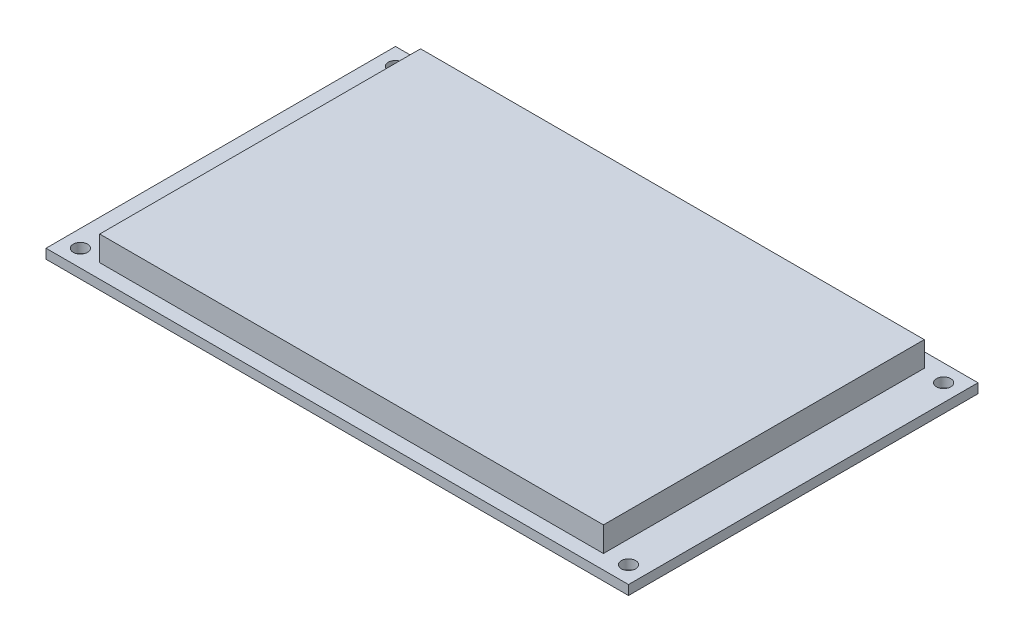
ISO-10303-21;
HEADER;
FILE_DESCRIPTION(('STEP AP214'),'2;1');
FILE_NAME('part.step','',(''),(''),'','','');
FILE_SCHEMA(('AUTOMOTIVE_DESIGN { 1 0 10303 214 1 1 1 1 }'));
ENDSEC;
DATA;
#1=APPLICATION_CONTEXT('core data for automotive mechanical design processes');
#2=APPLICATION_PROTOCOL_DEFINITION('international standard','automotive_design',2000,#1);
#3=PRODUCT_CONTEXT('',#1,'mechanical');
#4=PRODUCT('Part','Part','',(#3));
#5=PRODUCT_RELATED_PRODUCT_CATEGORY('part','',(#4));
#6=PRODUCT_DEFINITION_FORMATION('','',#4);
#7=PRODUCT_DEFINITION_CONTEXT('part definition',#1,'design');
#8=PRODUCT_DEFINITION('design','',#6,#7);
#9=PRODUCT_DEFINITION_SHAPE('','',#8);
#10=(LENGTH_UNIT() NAMED_UNIT(*) SI_UNIT(.MILLI.,.METRE.));
#11=(NAMED_UNIT(*) PLANE_ANGLE_UNIT() SI_UNIT($,.RADIAN.));
#12=(NAMED_UNIT(*) SI_UNIT($,.STERADIAN.) SOLID_ANGLE_UNIT());
#13=UNCERTAINTY_MEASURE_WITH_UNIT(LENGTH_MEASURE(1.E-05),#10,'distance_accuracy_value','');
#14=(GEOMETRIC_REPRESENTATION_CONTEXT(3) GLOBAL_UNCERTAINTY_ASSIGNED_CONTEXT((#13)) GLOBAL_UNIT_ASSIGNED_CONTEXT((#10,
#11,#12)) REPRESENTATION_CONTEXT('',''));
#15=CARTESIAN_POINT('',(0.,0.,0.));
#16=DIRECTION('',(0.,0.,1.));
#17=DIRECTION('',(1.,0.,0.));
#18=AXIS2_PLACEMENT_3D('',#15,#16,#17);
#19=CARTESIAN_POINT('',(0.,2.,0.));
#20=DIRECTION('',(0.,-1.,0.));
#21=DIRECTION('',(0.,0.,-1.));
#22=AXIS2_PLACEMENT_3D('',#19,#20,#21);
#23=PLANE('',#22);
#24=CARTESIAN_POINT('',(-57.4,2.,-33.));
#25=DIRECTION('',(0.,1.,0.));
#26=DIRECTION('',(0.,0.,-1.));
#27=AXIS2_PLACEMENT_3D('',#24,#25,#26);
#28=CIRCLE('',#27,1.5);
#29=CARTESIAN_POINT('',(-57.4,2.,-34.5));
#30=VERTEX_POINT('',#29);
#31=EDGE_CURVE('E129',#30,#30,#28,.T.);
#32=ORIENTED_EDGE('',*,*,#31,.F.);
#33=EDGE_LOOP('',(#32));
#34=FACE_BOUND('',#33,.T.);
#35=CARTESIAN_POINT('',(-57.4,2.,33.));
#36=DIRECTION('',(0.,1.,0.));
#37=DIRECTION('',(0.,0.,1.));
#38=AXIS2_PLACEMENT_3D('',#35,#36,#37);
#39=CIRCLE('',#38,1.5);
#40=CARTESIAN_POINT('',(-57.4,2.,34.5));
#41=VERTEX_POINT('',#40);
#42=EDGE_CURVE('E138',#41,#41,#39,.T.);
#43=ORIENTED_EDGE('',*,*,#42,.F.);
#44=EDGE_LOOP('',(#43));
#45=FACE_BOUND('',#44,.T.);
#46=CARTESIAN_POINT('',(57.4,2.,33.));
#47=DIRECTION('',(0.,1.,0.));
#48=DIRECTION('',(0.,0.,-1.));
#49=AXIS2_PLACEMENT_3D('',#46,#47,#48);
#50=CIRCLE('',#49,1.5);
#51=CARTESIAN_POINT('',(57.4,2.,31.5));
#52=VERTEX_POINT('',#51);
#53=EDGE_CURVE('E144',#52,#52,#50,.T.);
#54=ORIENTED_EDGE('',*,*,#53,.F.);
#55=EDGE_LOOP('',(#54));
#56=FACE_BOUND('',#55,.T.);
#57=CARTESIAN_POINT('',(57.4,2.,-33.));
#58=DIRECTION('',(0.,1.,0.));
#59=DIRECTION('',(0.,0.,1.));
#60=AXIS2_PLACEMENT_3D('',#57,#58,#59);
#61=CIRCLE('',#60,1.5);
#62=CARTESIAN_POINT('',(57.4,2.,-31.5));
#63=VERTEX_POINT('',#62);
#64=EDGE_CURVE('E150',#63,#63,#61,.T.);
#65=ORIENTED_EDGE('',*,*,#64,.F.);
#66=EDGE_LOOP('',(#65));
#67=FACE_BOUND('',#66,.T.);
#68=DIRECTION('',(0.,0.,-1.));
#69=VECTOR('',#68,1.);
#70=CARTESIAN_POINT('',(61.,2.,36.6));
#71=LINE('',#70,#69);
#72=CARTESIAN_POINT('',(61.,2.,36.6));
#73=VERTEX_POINT('',#72);
#74=CARTESIAN_POINT('',(61.,2.,-36.6));
#75=VERTEX_POINT('',#74);
#76=EDGE_CURVE('E156',#73,#75,#71,.T.);
#77=ORIENTED_EDGE('',*,*,#76,.T.);
#78=DIRECTION('',(-1.,0.,0.));
#79=VECTOR('',#78,1.);
#80=CARTESIAN_POINT('',(-61.,2.,-36.6));
#81=LINE('',#80,#79);
#82=CARTESIAN_POINT('',(-61.,2.,-36.6));
#83=VERTEX_POINT('',#82);
#84=EDGE_CURVE('E159',#75,#83,#81,.T.);
#85=ORIENTED_EDGE('',*,*,#84,.T.);
#86=DIRECTION('',(0.,0.,1.));
#87=VECTOR('',#86,1.);
#88=CARTESIAN_POINT('',(-61.,2.,36.6));
#89=LINE('',#88,#87);
#90=CARTESIAN_POINT('',(-61.,2.,36.6));
#91=VERTEX_POINT('',#90);
#92=EDGE_CURVE('E162',#83,#91,#89,.T.);
#93=ORIENTED_EDGE('',*,*,#92,.T.);
#94=DIRECTION('',(1.,0.,0.));
#95=VECTOR('',#94,1.);
#96=CARTESIAN_POINT('',(-61.,2.,36.6));
#97=LINE('',#96,#95);
#98=EDGE_CURVE('E164',#91,#73,#97,.T.);
#99=ORIENTED_EDGE('',*,*,#98,.T.);
#100=EDGE_LOOP('',(#77,#85,#93,#99));
#101=FACE_BOUND('',#100,.T.);
#102=DIRECTION('',(0.,0.,-1.));
#103=VECTOR('',#102,1.);
#104=CARTESIAN_POINT('',(52.75,2.,33.6));
#105=LINE('',#104,#103);
#106=CARTESIAN_POINT('',(52.75,2.,33.6));
#107=VERTEX_POINT('',#106);
#108=CARTESIAN_POINT('',(52.75,2.,-33.6));
#109=VERTEX_POINT('',#108);
#110=EDGE_CURVE('E56',#107,#109,#105,.T.);
#111=ORIENTED_EDGE('',*,*,#110,.F.);
#112=DIRECTION('',(1.,0.,0.));
#113=VECTOR('',#112,1.);
#114=CARTESIAN_POINT('',(-52.75,2.,33.6));
#115=LINE('',#114,#113);
#116=CARTESIAN_POINT('',(-52.75,2.,33.6));
#117=VERTEX_POINT('',#116);
#118=EDGE_CURVE('E60',#117,#107,#115,.T.);
#119=ORIENTED_EDGE('',*,*,#118,.F.);
#120=DIRECTION('',(0.,0.,1.));
#121=VECTOR('',#120,1.);
#122=CARTESIAN_POINT('',(-52.75,2.,33.6));
#123=LINE('',#122,#121);
#124=CARTESIAN_POINT('',(-52.75,2.,-33.6));
#125=VERTEX_POINT('',#124);
#126=EDGE_CURVE('E343',#125,#117,#123,.T.);
#127=ORIENTED_EDGE('',*,*,#126,.F.);
#128=DIRECTION('',(-1.,0.,0.));
#129=VECTOR('',#128,1.);
#130=CARTESIAN_POINT('',(-52.75,2.,-33.6));
#131=LINE('',#130,#129);
#132=EDGE_CURVE('E349',#109,#125,#131,.T.);
#133=ORIENTED_EDGE('',*,*,#132,.F.);
#134=EDGE_LOOP('',(#111,#119,#127,#133));
#135=FACE_BOUND('',#134,.T.);
#136=ADVANCED_FACE('F41',(#34,#45,#56,#67,#101,#135),#23,.F.);
#137=CARTESIAN_POINT('',(0.,0.,0.));
#138=DIRECTION('',(0.,-1.,0.));
#139=DIRECTION('',(0.,0.,-1.));
#140=AXIS2_PLACEMENT_3D('',#137,#138,#139);
#141=PLANE('',#140);
#142=CARTESIAN_POINT('',(-57.4,0.,33.));
#143=DIRECTION('',(0.,1.,0.));
#144=DIRECTION('',(0.,0.,1.));
#145=AXIS2_PLACEMENT_3D('',#142,#143,#144);
#146=CIRCLE('',#145,1.5);
#147=CARTESIAN_POINT('',(-57.4,0.,34.5));
#148=VERTEX_POINT('',#147);
#149=EDGE_CURVE('E136',#148,#148,#146,.T.);
#150=ORIENTED_EDGE('',*,*,#149,.T.);
#151=EDGE_LOOP('',(#150));
#152=FACE_BOUND('',#151,.T.);
#153=CARTESIAN_POINT('',(57.4,0.,-33.));
#154=DIRECTION('',(0.,1.,0.));
#155=DIRECTION('',(0.,0.,1.));
#156=AXIS2_PLACEMENT_3D('',#153,#154,#155);
#157=CIRCLE('',#156,1.5);
#158=CARTESIAN_POINT('',(57.4,0.,-31.5));
#159=VERTEX_POINT('',#158);
#160=EDGE_CURVE('E147',#159,#159,#157,.T.);
#161=ORIENTED_EDGE('',*,*,#160,.T.);
#162=EDGE_LOOP('',(#161));
#163=FACE_BOUND('',#162,.T.);
#164=DIRECTION('',(0.,0.,-1.));
#165=VECTOR('',#164,1.);
#166=CARTESIAN_POINT('',(61.,0.,36.6));
#167=LINE('',#166,#165);
#168=CARTESIAN_POINT('',(61.,0.,36.6));
#169=VERTEX_POINT('',#168);
#170=CARTESIAN_POINT('',(61.,0.,-36.6));
#171=VERTEX_POINT('',#170);
#172=EDGE_CURVE('E153',#169,#171,#167,.T.);
#173=ORIENTED_EDGE('',*,*,#172,.F.);
#174=DIRECTION('',(1.,0.,0.));
#175=VECTOR('',#174,1.);
#176=CARTESIAN_POINT('',(-61.,0.,36.6));
#177=LINE('',#176,#175);
#178=CARTESIAN_POINT('',(-61.,0.,36.6));
#179=VERTEX_POINT('',#178);
#180=EDGE_CURVE('E160',#179,#169,#177,.T.);
#181=ORIENTED_EDGE('',*,*,#180,.F.);
#182=DIRECTION('',(0.,0.,1.));
#183=VECTOR('',#182,1.);
#184=CARTESIAN_POINT('',(-61.,0.,36.6));
#185=LINE('',#184,#183);
#186=CARTESIAN_POINT('',(-61.,0.,-36.6));
#187=VERTEX_POINT('',#186);
#188=EDGE_CURVE('E171',#187,#179,#185,.T.);
#189=ORIENTED_EDGE('',*,*,#188,.F.);
#190=DIRECTION('',(-1.,0.,0.));
#191=VECTOR('',#190,1.);
#192=CARTESIAN_POINT('',(-61.,0.,-36.6));
#193=LINE('',#192,#191);
#194=EDGE_CURVE('E169',#171,#187,#193,.T.);
#195=ORIENTED_EDGE('',*,*,#194,.F.);
#196=EDGE_LOOP('',(#173,#181,#189,#195));
#197=FACE_BOUND('',#196,.T.);
#198=CARTESIAN_POINT('',(57.4,0.,33.));
#199=DIRECTION('',(0.,1.,0.));
#200=DIRECTION('',(0.,0.,-1.));
#201=AXIS2_PLACEMENT_3D('',#198,#199,#200);
#202=CIRCLE('',#201,1.5);
#203=CARTESIAN_POINT('',(57.4,0.,31.5));
#204=VERTEX_POINT('',#203);
#205=EDGE_CURVE('E141',#204,#204,#202,.T.);
#206=ORIENTED_EDGE('',*,*,#205,.T.);
#207=EDGE_LOOP('',(#206));
#208=FACE_BOUND('',#207,.T.);
#209=CARTESIAN_POINT('',(-57.4,0.,-33.));
#210=DIRECTION('',(0.,1.,0.));
#211=DIRECTION('',(0.,0.,-1.));
#212=AXIS2_PLACEMENT_3D('',#209,#210,#211);
#213=CIRCLE('',#212,1.5);
#214=CARTESIAN_POINT('',(-57.4,0.,-34.5));
#215=VERTEX_POINT('',#214);
#216=EDGE_CURVE('E126',#215,#215,#213,.T.);
#217=ORIENTED_EDGE('',*,*,#216,.T.);
#218=EDGE_LOOP('',(#217));
#219=FACE_BOUND('',#218,.T.);
#220=ADVANCED_FACE('F189',(#152,#163,#197,#208,#219),#141,.T.);
#221=CARTESIAN_POINT('',(61.,2.,36.6));
#222=DIRECTION('',(-1.,0.,0.));
#223=DIRECTION('',(0.,0.,1.));
#224=AXIS2_PLACEMENT_3D('',#221,#222,#223);
#225=PLANE('',#224);
#226=ORIENTED_EDGE('',*,*,#172,.T.);
#227=DIRECTION('',(0.,-1.,0.));
#228=VECTOR('',#227,1.);
#229=CARTESIAN_POINT('',(61.,2.,-36.6));
#230=LINE('',#229,#228);
#231=EDGE_CURVE('E11',#75,#171,#230,.T.);
#232=ORIENTED_EDGE('',*,*,#231,.F.);
#233=ORIENTED_EDGE('',*,*,#76,.F.);
#234=DIRECTION('',(0.,-1.,0.));
#235=VECTOR('',#234,1.);
#236=CARTESIAN_POINT('',(61.,2.,36.6));
#237=LINE('',#236,#235);
#238=EDGE_CURVE('E166',#73,#169,#237,.T.);
#239=ORIENTED_EDGE('',*,*,#238,.T.);
#240=EDGE_LOOP('',(#226,#232,#233,#239));
#241=FACE_BOUND('',#240,.T.);
#242=ADVANCED_FACE('F43',(#241),#225,.F.);
#243=CARTESIAN_POINT('',(-61.,2.,-36.6));
#244=DIRECTION('',(0.,0.,1.));
#245=DIRECTION('',(1.,0.,0.));
#246=AXIS2_PLACEMENT_3D('',#243,#244,#245);
#247=PLANE('',#246);
#248=ORIENTED_EDGE('',*,*,#194,.T.);
#249=DIRECTION('',(0.,-1.,0.));
#250=VECTOR('',#249,1.);
#251=CARTESIAN_POINT('',(-61.,2.,-36.6));
#252=LINE('',#251,#250);
#253=EDGE_CURVE('E49',#83,#187,#252,.T.);
#254=ORIENTED_EDGE('',*,*,#253,.F.);
#255=ORIENTED_EDGE('',*,*,#84,.F.);
#256=ORIENTED_EDGE('',*,*,#231,.T.);
#257=EDGE_LOOP('',(#248,#254,#255,#256));
#258=FACE_BOUND('',#257,.T.);
#259=ADVANCED_FACE('F199',(#258),#247,.F.);
#260=CARTESIAN_POINT('',(-61.,2.,36.6));
#261=DIRECTION('',(1.,0.,0.));
#262=DIRECTION('',(0.,0.,-1.));
#263=AXIS2_PLACEMENT_3D('',#260,#261,#262);
#264=PLANE('',#263);
#265=ORIENTED_EDGE('',*,*,#188,.T.);
#266=DIRECTION('',(0.,-1.,0.));
#267=VECTOR('',#266,1.);
#268=CARTESIAN_POINT('',(-61.,2.,36.6));
#269=LINE('',#268,#267);
#270=EDGE_CURVE('E176',#91,#179,#269,.T.);
#271=ORIENTED_EDGE('',*,*,#270,.F.);
#272=ORIENTED_EDGE('',*,*,#92,.F.);
#273=ORIENTED_EDGE('',*,*,#253,.T.);
#274=EDGE_LOOP('',(#265,#271,#272,#273));
#275=FACE_BOUND('',#274,.T.);
#276=ADVANCED_FACE('F183',(#275),#264,.F.);
#277=CARTESIAN_POINT('',(-61.,2.,36.6));
#278=DIRECTION('',(0.,0.,-1.));
#279=DIRECTION('',(-1.,0.,0.));
#280=AXIS2_PLACEMENT_3D('',#277,#278,#279);
#281=PLANE('',#280);
#282=ORIENTED_EDGE('',*,*,#180,.T.);
#283=ORIENTED_EDGE('',*,*,#238,.F.);
#284=ORIENTED_EDGE('',*,*,#98,.F.);
#285=ORIENTED_EDGE('',*,*,#270,.T.);
#286=EDGE_LOOP('',(#282,#283,#284,#285));
#287=FACE_BOUND('',#286,.T.);
#288=ADVANCED_FACE('F193',(#287),#281,.F.);
#289=CARTESIAN_POINT('',(57.4,2.,-33.));
#290=DIRECTION('',(0.,-1.,0.));
#291=DIRECTION('',(0.,0.,-1.));
#292=AXIS2_PLACEMENT_3D('',#289,#290,#291);
#293=CYLINDRICAL_SURFACE('',#292,1.5);
#294=ORIENTED_EDGE('',*,*,#64,.T.);
#295=EDGE_LOOP('',(#294));
#296=FACE_BOUND('',#295,.T.);
#297=ORIENTED_EDGE('',*,*,#160,.F.);
#298=EDGE_LOOP('',(#297));
#299=FACE_BOUND('',#298,.T.);
#300=ADVANCED_FACE('F219',(#296,#299),#293,.F.);
#301=CARTESIAN_POINT('',(57.4,2.,33.));
#302=DIRECTION('',(0.,-1.,0.));
#303=DIRECTION('',(0.,0.,-1.));
#304=AXIS2_PLACEMENT_3D('',#301,#302,#303);
#305=CYLINDRICAL_SURFACE('',#304,1.5);
#306=ORIENTED_EDGE('',*,*,#53,.T.);
#307=EDGE_LOOP('',(#306));
#308=FACE_BOUND('',#307,.T.);
#309=ORIENTED_EDGE('',*,*,#205,.F.);
#310=EDGE_LOOP('',(#309));
#311=FACE_BOUND('',#310,.T.);
#312=ADVANCED_FACE('F226',(#308,#311),#305,.F.);
#313=CARTESIAN_POINT('',(-57.4,2.,33.));
#314=DIRECTION('',(0.,-1.,0.));
#315=DIRECTION('',(0.,0.,-1.));
#316=AXIS2_PLACEMENT_3D('',#313,#314,#315);
#317=CYLINDRICAL_SURFACE('',#316,1.5);
#318=ORIENTED_EDGE('',*,*,#42,.T.);
#319=EDGE_LOOP('',(#318));
#320=FACE_BOUND('',#319,.T.);
#321=ORIENTED_EDGE('',*,*,#149,.F.);
#322=EDGE_LOOP('',(#321));
#323=FACE_BOUND('',#322,.T.);
#324=ADVANCED_FACE('F231',(#320,#323),#317,.F.);
#325=CARTESIAN_POINT('',(-57.4,2.,-33.));
#326=DIRECTION('',(0.,-1.,0.));
#327=DIRECTION('',(0.,0.,-1.));
#328=AXIS2_PLACEMENT_3D('',#325,#326,#327);
#329=CYLINDRICAL_SURFACE('',#328,1.5);
#330=ORIENTED_EDGE('',*,*,#31,.T.);
#331=EDGE_LOOP('',(#330));
#332=FACE_BOUND('',#331,.T.);
#333=ORIENTED_EDGE('',*,*,#216,.F.);
#334=EDGE_LOOP('',(#333));
#335=FACE_BOUND('',#334,.T.);
#336=ADVANCED_FACE('F241',(#332,#335),#329,.F.);
#337=CARTESIAN_POINT('',(52.75,7.2,33.6));
#338=DIRECTION('',(-1.,0.,0.));
#339=DIRECTION('',(0.,0.,1.));
#340=AXIS2_PLACEMENT_3D('',#337,#338,#339);
#341=PLANE('',#340);
#342=ORIENTED_EDGE('',*,*,#110,.T.);
#343=DIRECTION('',(0.,-1.,0.));
#344=VECTOR('',#343,1.);
#345=CARTESIAN_POINT('',(52.75,7.2,-33.6));
#346=LINE('',#345,#344);
#347=CARTESIAN_POINT('',(52.75,7.2,-33.6));
#348=VERTEX_POINT('',#347);
#349=EDGE_CURVE('E109',#348,#109,#346,.T.);
#350=ORIENTED_EDGE('',*,*,#349,.F.);
#351=DIRECTION('',(0.,0.,-1.));
#352=VECTOR('',#351,1.);
#353=CARTESIAN_POINT('',(52.75,7.2,33.6));
#354=LINE('',#353,#352);
#355=CARTESIAN_POINT('',(52.75,7.2,33.6));
#356=VERTEX_POINT('',#355);
#357=EDGE_CURVE('E115',#356,#348,#354,.T.);
#358=ORIENTED_EDGE('',*,*,#357,.F.);
#359=DIRECTION('',(0.,-1.,0.));
#360=VECTOR('',#359,1.);
#361=CARTESIAN_POINT('',(52.75,7.2,33.6));
#362=LINE('',#361,#360);
#363=EDGE_CURVE('E341',#356,#107,#362,.T.);
#364=ORIENTED_EDGE('',*,*,#363,.T.);
#365=EDGE_LOOP('',(#342,#350,#358,#364));
#366=FACE_BOUND('',#365,.T.);
#367=ADVANCED_FACE('F125',(#366),#341,.F.);
#368=CARTESIAN_POINT('',(-52.75,7.2,-33.6));
#369=DIRECTION('',(0.,0.,1.));
#370=DIRECTION('',(1.,0.,0.));
#371=AXIS2_PLACEMENT_3D('',#368,#369,#370);
#372=PLANE('',#371);
#373=ORIENTED_EDGE('',*,*,#132,.T.);
#374=DIRECTION('',(0.,-1.,0.));
#375=VECTOR('',#374,1.);
#376=CARTESIAN_POINT('',(-52.75,7.2,-33.6));
#377=LINE('',#376,#375);
#378=CARTESIAN_POINT('',(-52.75,7.2,-33.6));
#379=VERTEX_POINT('',#378);
#380=EDGE_CURVE('E111',#379,#125,#377,.T.);
#381=ORIENTED_EDGE('',*,*,#380,.F.);
#382=DIRECTION('',(-1.,0.,0.));
#383=VECTOR('',#382,1.);
#384=CARTESIAN_POINT('',(-52.75,7.2,-33.6));
#385=LINE('',#384,#383);
#386=EDGE_CURVE('E104',#348,#379,#385,.T.);
#387=ORIENTED_EDGE('',*,*,#386,.F.);
#388=ORIENTED_EDGE('',*,*,#349,.T.);
#389=EDGE_LOOP('',(#373,#381,#387,#388));
#390=FACE_BOUND('',#389,.T.);
#391=ADVANCED_FACE('F107',(#390),#372,.F.);
#392=CARTESIAN_POINT('',(-52.75,7.2,33.6));
#393=DIRECTION('',(1.,0.,0.));
#394=DIRECTION('',(0.,0.,-1.));
#395=AXIS2_PLACEMENT_3D('',#392,#393,#394);
#396=PLANE('',#395);
#397=ORIENTED_EDGE('',*,*,#126,.T.);
#398=DIRECTION('',(0.,-1.,0.));
#399=VECTOR('',#398,1.);
#400=CARTESIAN_POINT('',(-52.75,7.2,33.6));
#401=LINE('',#400,#399);
#402=CARTESIAN_POINT('',(-52.75,7.2,33.6));
#403=VERTEX_POINT('',#402);
#404=EDGE_CURVE('E131',#403,#117,#401,.T.);
#405=ORIENTED_EDGE('',*,*,#404,.F.);
#406=DIRECTION('',(0.,0.,1.));
#407=VECTOR('',#406,1.);
#408=CARTESIAN_POINT('',(-52.75,7.2,33.6));
#409=LINE('',#408,#407);
#410=EDGE_CURVE('E114',#379,#403,#409,.T.);
#411=ORIENTED_EDGE('',*,*,#410,.F.);
#412=ORIENTED_EDGE('',*,*,#380,.T.);
#413=EDGE_LOOP('',(#397,#405,#411,#412));
#414=FACE_BOUND('',#413,.T.);
#415=ADVANCED_FACE('F251',(#414),#396,.F.);
#416=CARTESIAN_POINT('',(-52.75,7.2,33.6));
#417=DIRECTION('',(0.,0.,-1.));
#418=DIRECTION('',(-1.,0.,0.));
#419=AXIS2_PLACEMENT_3D('',#416,#417,#418);
#420=PLANE('',#419);
#421=ORIENTED_EDGE('',*,*,#118,.T.);
#422=ORIENTED_EDGE('',*,*,#363,.F.);
#423=DIRECTION('',(1.,0.,0.));
#424=VECTOR('',#423,1.);
#425=CARTESIAN_POINT('',(-52.75,7.2,33.6));
#426=LINE('',#425,#424);
#427=EDGE_CURVE('E120',#403,#356,#426,.T.);
#428=ORIENTED_EDGE('',*,*,#427,.F.);
#429=ORIENTED_EDGE('',*,*,#404,.T.);
#430=EDGE_LOOP('',(#421,#422,#428,#429));
#431=FACE_BOUND('',#430,.T.);
#432=ADVANCED_FACE('F254',(#431),#420,.F.);
#433=CARTESIAN_POINT('',(0.,7.2,0.));
#434=DIRECTION('',(0.,-1.,0.));
#435=DIRECTION('',(0.,0.,-1.));
#436=AXIS2_PLACEMENT_3D('',#433,#434,#435);
#437=PLANE('',#436);
#438=ORIENTED_EDGE('',*,*,#357,.T.);
#439=ORIENTED_EDGE('',*,*,#386,.T.);
#440=ORIENTED_EDGE('',*,*,#410,.T.);
#441=ORIENTED_EDGE('',*,*,#427,.T.);
#442=EDGE_LOOP('',(#438,#439,#440,#441));
#443=FACE_BOUND('',#442,.T.);
#444=ADVANCED_FACE('F118',(#443),#437,.F.);
#445=CLOSED_SHELL('',(#136,#220,#242,#259,#276,#288,#300,#312,#324,#336,#367,#391,#415,#432,#444));
#446=MANIFOLD_SOLID_BREP('B2',#445);
#447=ADVANCED_BREP_SHAPE_REPRESENTATION('',(#18,#446),#14);
#448=SHAPE_DEFINITION_REPRESENTATION(#9,#447);
ENDSEC;
END-ISO-10303-21;
